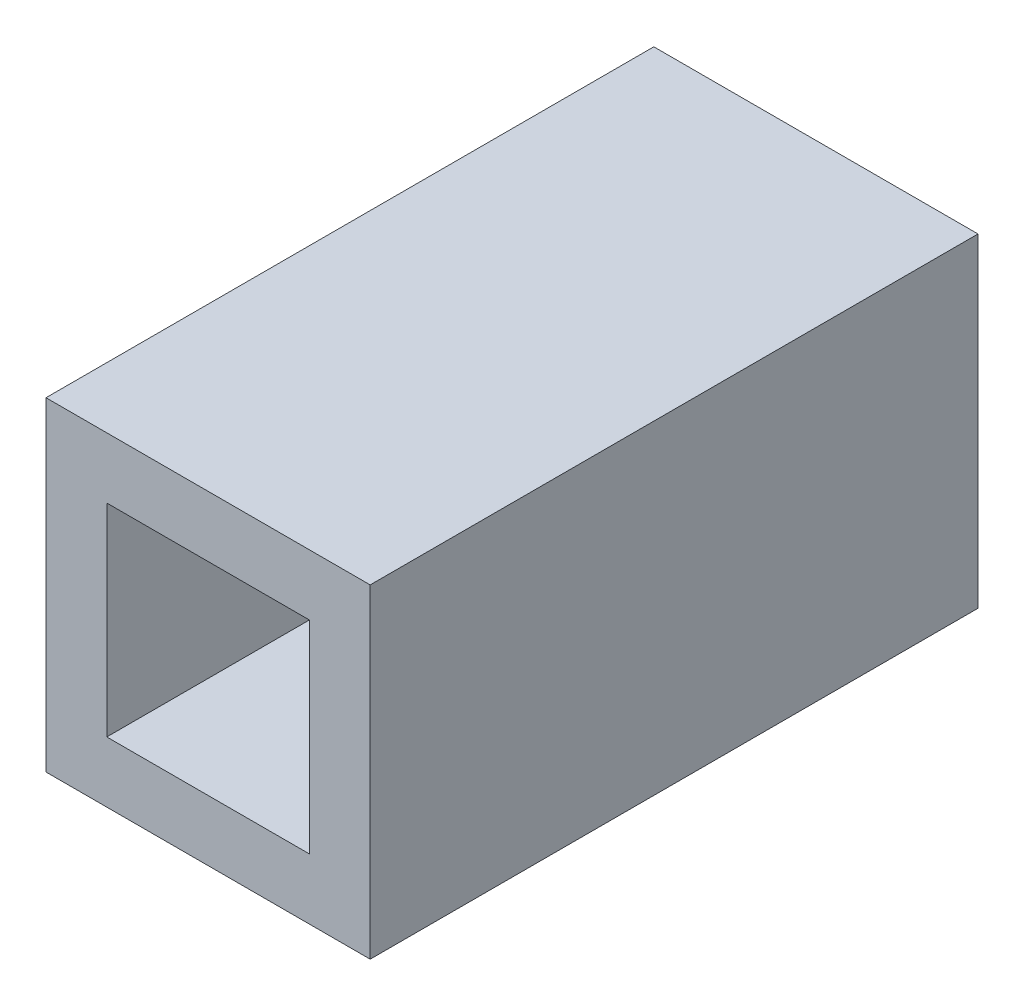
ISO-10303-21;
HEADER;
FILE_DESCRIPTION(('STEP AP214'),'2;1');
FILE_NAME('part.step','',(''),(''),'','','');
FILE_SCHEMA(('AUTOMOTIVE_DESIGN { 1 0 10303 214 1 1 1 1 }'));
ENDSEC;
DATA;
#1=APPLICATION_CONTEXT('core data for automotive mechanical design processes');
#2=APPLICATION_PROTOCOL_DEFINITION('international standard','automotive_design',2000,#1);
#3=PRODUCT_CONTEXT('',#1,'mechanical');
#4=PRODUCT('Part','Part','',(#3));
#5=PRODUCT_RELATED_PRODUCT_CATEGORY('part','',(#4));
#6=PRODUCT_DEFINITION_FORMATION('','',#4);
#7=PRODUCT_DEFINITION_CONTEXT('part definition',#1,'design');
#8=PRODUCT_DEFINITION('design','',#6,#7);
#9=PRODUCT_DEFINITION_SHAPE('','',#8);
#10=(LENGTH_UNIT() NAMED_UNIT(*) SI_UNIT(.MILLI.,.METRE.));
#11=(NAMED_UNIT(*) PLANE_ANGLE_UNIT() SI_UNIT($,.RADIAN.));
#12=(NAMED_UNIT(*) SI_UNIT($,.STERADIAN.) SOLID_ANGLE_UNIT());
#13=UNCERTAINTY_MEASURE_WITH_UNIT(LENGTH_MEASURE(1.E-05),#10,'distance_accuracy_value','');
#14=(GEOMETRIC_REPRESENTATION_CONTEXT(3) GLOBAL_UNCERTAINTY_ASSIGNED_CONTEXT((#13)) GLOBAL_UNIT_ASSIGNED_CONTEXT((#10,
#11,#12)) REPRESENTATION_CONTEXT('',''));
#15=CARTESIAN_POINT('',(0.,0.,0.));
#16=DIRECTION('',(0.,0.,1.));
#17=DIRECTION('',(1.,0.,0.));
#18=AXIS2_PLACEMENT_3D('',#15,#16,#17);
#19=CARTESIAN_POINT('',(0.,0.,150.));
#20=DIRECTION('',(0.,0.,-1.));
#21=DIRECTION('',(-1.,0.,0.));
#22=AXIS2_PLACEMENT_3D('',#19,#20,#21);
#23=PLANE('',#22);
#24=DIRECTION('',(0.,-1.,0.));
#25=VECTOR('',#24,1.);
#26=CARTESIAN_POINT('',(-40.,40.,150.));
#27=LINE('',#26,#25);
#28=CARTESIAN_POINT('',(-40.,40.,150.));
#29=VERTEX_POINT('',#28);
#30=CARTESIAN_POINT('',(-40.,-40.,150.));
#31=VERTEX_POINT('',#30);
#32=EDGE_CURVE('E137',#29,#31,#27,.T.);
#33=ORIENTED_EDGE('',*,*,#32,.T.);
#34=DIRECTION('',(1.,0.,0.));
#35=VECTOR('',#34,1.);
#36=CARTESIAN_POINT('',(40.,-40.,150.));
#37=LINE('',#36,#35);
#38=CARTESIAN_POINT('',(40.,-40.,150.));
#39=VERTEX_POINT('',#38);
#40=EDGE_CURVE('E140',#31,#39,#37,.T.);
#41=ORIENTED_EDGE('',*,*,#40,.T.);
#42=DIRECTION('',(0.,1.,0.));
#43=VECTOR('',#42,1.);
#44=CARTESIAN_POINT('',(40.,40.,150.));
#45=LINE('',#44,#43);
#46=CARTESIAN_POINT('',(40.,40.,150.));
#47=VERTEX_POINT('',#46);
#48=EDGE_CURVE('E143',#39,#47,#45,.T.);
#49=ORIENTED_EDGE('',*,*,#48,.T.);
#50=DIRECTION('',(-1.,0.,0.));
#51=VECTOR('',#50,1.);
#52=CARTESIAN_POINT('',(40.,40.,150.));
#53=LINE('',#52,#51);
#54=EDGE_CURVE('E145',#47,#29,#53,.T.);
#55=ORIENTED_EDGE('',*,*,#54,.T.);
#56=EDGE_LOOP('',(#33,#41,#49,#55));
#57=FACE_BOUND('',#56,.T.);
#58=DIRECTION('',(0.,1.,0.));
#59=VECTOR('',#58,1.);
#60=CARTESIAN_POINT('',(25.,25.,150.));
#61=LINE('',#60,#59);
#62=CARTESIAN_POINT('',(25.,-25.,150.));
#63=VERTEX_POINT('',#62);
#64=CARTESIAN_POINT('',(25.,25.,150.));
#65=VERTEX_POINT('',#64);
#66=EDGE_CURVE('E99',#63,#65,#61,.T.);
#67=ORIENTED_EDGE('',*,*,#66,.F.);
#68=DIRECTION('',(1.,0.,0.));
#69=VECTOR('',#68,1.);
#70=CARTESIAN_POINT('',(25.,-25.,150.));
#71=LINE('',#70,#69);
#72=CARTESIAN_POINT('',(-25.,-25.,150.));
#73=VERTEX_POINT('',#72);
#74=EDGE_CURVE('E121',#73,#63,#71,.T.);
#75=ORIENTED_EDGE('',*,*,#74,.F.);
#76=DIRECTION('',(0.,-1.,0.));
#77=VECTOR('',#76,1.);
#78=CARTESIAN_POINT('',(-25.,25.,150.));
#79=LINE('',#78,#77);
#80=CARTESIAN_POINT('',(-25.,25.,150.));
#81=VERTEX_POINT('',#80);
#82=EDGE_CURVE('E119',#81,#73,#79,.T.);
#83=ORIENTED_EDGE('',*,*,#82,.F.);
#84=DIRECTION('',(-1.,0.,0.));
#85=VECTOR('',#84,1.);
#86=CARTESIAN_POINT('',(25.,25.,150.));
#87=LINE('',#86,#85);
#88=EDGE_CURVE('E107',#65,#81,#87,.T.);
#89=ORIENTED_EDGE('',*,*,#88,.F.);
#90=EDGE_LOOP('',(#67,#75,#83,#89));
#91=FACE_BOUND('',#90,.T.);
#92=ADVANCED_FACE('F34',(#57,#91),#23,.F.);
#93=CARTESIAN_POINT('',(0.,0.,0.));
#94=DIRECTION('',(0.,0.,-1.));
#95=DIRECTION('',(-1.,0.,0.));
#96=AXIS2_PLACEMENT_3D('',#93,#94,#95);
#97=PLANE('',#96);
#98=DIRECTION('',(0.,-1.,0.));
#99=VECTOR('',#98,1.);
#100=CARTESIAN_POINT('',(-40.,40.,0.));
#101=LINE('',#100,#99);
#102=CARTESIAN_POINT('',(-40.,40.,0.));
#103=VERTEX_POINT('',#102);
#104=CARTESIAN_POINT('',(-40.,-40.,0.));
#105=VERTEX_POINT('',#104);
#106=EDGE_CURVE('E115',#103,#105,#101,.T.);
#107=ORIENTED_EDGE('',*,*,#106,.F.);
#108=DIRECTION('',(-1.,0.,0.));
#109=VECTOR('',#108,1.);
#110=CARTESIAN_POINT('',(40.,40.,0.));
#111=LINE('',#110,#109);
#112=CARTESIAN_POINT('',(40.,40.,0.));
#113=VERTEX_POINT('',#112);
#114=EDGE_CURVE('E141',#113,#103,#111,.T.);
#115=ORIENTED_EDGE('',*,*,#114,.F.);
#116=DIRECTION('',(0.,1.,0.));
#117=VECTOR('',#116,1.);
#118=CARTESIAN_POINT('',(40.,40.,0.));
#119=LINE('',#118,#117);
#120=CARTESIAN_POINT('',(40.,-40.,0.));
#121=VERTEX_POINT('',#120);
#122=EDGE_CURVE('E152',#121,#113,#119,.T.);
#123=ORIENTED_EDGE('',*,*,#122,.F.);
#124=DIRECTION('',(1.,0.,0.));
#125=VECTOR('',#124,1.);
#126=CARTESIAN_POINT('',(40.,-40.,0.));
#127=LINE('',#126,#125);
#128=EDGE_CURVE('E150',#105,#121,#127,.T.);
#129=ORIENTED_EDGE('',*,*,#128,.F.);
#130=EDGE_LOOP('',(#107,#115,#123,#129));
#131=FACE_BOUND('',#130,.T.);
#132=DIRECTION('',(1.,0.,0.));
#133=VECTOR('',#132,1.);
#134=CARTESIAN_POINT('',(25.,-25.,0.));
#135=LINE('',#134,#133);
#136=CARTESIAN_POINT('',(-25.,-25.,0.));
#137=VERTEX_POINT('',#136);
#138=CARTESIAN_POINT('',(25.,-25.,0.));
#139=VERTEX_POINT('',#138);
#140=EDGE_CURVE('E108',#137,#139,#135,.T.);
#141=ORIENTED_EDGE('',*,*,#140,.T.);
#142=DIRECTION('',(0.,1.,0.));
#143=VECTOR('',#142,1.);
#144=CARTESIAN_POINT('',(25.,25.,0.));
#145=LINE('',#144,#143);
#146=CARTESIAN_POINT('',(25.,25.,0.));
#147=VERTEX_POINT('',#146);
#148=EDGE_CURVE('E57',#139,#147,#145,.T.);
#149=ORIENTED_EDGE('',*,*,#148,.T.);
#150=DIRECTION('',(-1.,0.,0.));
#151=VECTOR('',#150,1.);
#152=CARTESIAN_POINT('',(25.,25.,0.));
#153=LINE('',#152,#151);
#154=CARTESIAN_POINT('',(-25.,25.,0.));
#155=VERTEX_POINT('',#154);
#156=EDGE_CURVE('E114',#147,#155,#153,.T.);
#157=ORIENTED_EDGE('',*,*,#156,.T.);
#158=DIRECTION('',(0.,-1.,0.));
#159=VECTOR('',#158,1.);
#160=CARTESIAN_POINT('',(-25.,25.,0.));
#161=LINE('',#160,#159);
#162=EDGE_CURVE('E129',#155,#137,#161,.T.);
#163=ORIENTED_EDGE('',*,*,#162,.T.);
#164=EDGE_LOOP('',(#141,#149,#157,#163));
#165=FACE_BOUND('',#164,.T.);
#166=ADVANCED_FACE('F170',(#131,#165),#97,.T.);
#167=CARTESIAN_POINT('',(-40.,40.,150.));
#168=DIRECTION('',(1.,0.,0.));
#169=DIRECTION('',(0.,1.,0.));
#170=AXIS2_PLACEMENT_3D('',#167,#168,#169);
#171=PLANE('',#170);
#172=CARTESIAN_POINT('',(-40.,0.,75.));
#173=DIRECTION('',(-1.,0.,0.));
#174=DIRECTION('',(0.,-1.,0.));
#175=AXIS2_PLACEMENT_3D('',#172,#173,#174);
#176=CIRCLE('',#175,5.);
#177=CARTESIAN_POINT('',(-40.,-5.00000000000001,75.));
#178=VERTEX_POINT('',#177);
#179=EDGE_CURVE('E225',#178,#178,#176,.T.);
#180=ORIENTED_EDGE('',*,*,#179,.F.);
#181=EDGE_LOOP('',(#180));
#182=FACE_BOUND('',#181,.T.);
#183=ORIENTED_EDGE('',*,*,#106,.T.);
#184=DIRECTION('',(0.,0.,-1.));
#185=VECTOR('',#184,1.);
#186=CARTESIAN_POINT('',(-40.,-40.,150.));
#187=LINE('',#186,#185);
#188=EDGE_CURVE('E11',#31,#105,#187,.T.);
#189=ORIENTED_EDGE('',*,*,#188,.F.);
#190=ORIENTED_EDGE('',*,*,#32,.F.);
#191=DIRECTION('',(0.,0.,-1.));
#192=VECTOR('',#191,1.);
#193=CARTESIAN_POINT('',(-40.,40.,150.));
#194=LINE('',#193,#192);
#195=EDGE_CURVE('E147',#29,#103,#194,.T.);
#196=ORIENTED_EDGE('',*,*,#195,.T.);
#197=EDGE_LOOP('',(#183,#189,#190,#196));
#198=FACE_BOUND('',#197,.T.);
#199=ADVANCED_FACE('F36',(#182,#198),#171,.F.);
#200=CARTESIAN_POINT('',(40.,-40.,150.));
#201=DIRECTION('',(0.,1.,0.));
#202=DIRECTION('',(-1.,0.,0.));
#203=AXIS2_PLACEMENT_3D('',#200,#201,#202);
#204=PLANE('',#203);
#205=ORIENTED_EDGE('',*,*,#128,.T.);
#206=DIRECTION('',(0.,0.,-1.));
#207=VECTOR('',#206,1.);
#208=CARTESIAN_POINT('',(40.,-40.,150.));
#209=LINE('',#208,#207);
#210=EDGE_CURVE('E42',#39,#121,#209,.T.);
#211=ORIENTED_EDGE('',*,*,#210,.F.);
#212=ORIENTED_EDGE('',*,*,#40,.F.);
#213=ORIENTED_EDGE('',*,*,#188,.T.);
#214=EDGE_LOOP('',(#205,#211,#212,#213));
#215=FACE_BOUND('',#214,.T.);
#216=ADVANCED_FACE('F180',(#215),#204,.F.);
#217=CARTESIAN_POINT('',(40.,40.,150.));
#218=DIRECTION('',(-1.,0.,0.));
#219=DIRECTION('',(0.,-1.,0.));
#220=AXIS2_PLACEMENT_3D('',#217,#218,#219);
#221=PLANE('',#220);
#222=ORIENTED_EDGE('',*,*,#122,.T.);
#223=DIRECTION('',(0.,0.,-1.));
#224=VECTOR('',#223,1.);
#225=CARTESIAN_POINT('',(40.,40.,150.));
#226=LINE('',#225,#224);
#227=EDGE_CURVE('E157',#47,#113,#226,.T.);
#228=ORIENTED_EDGE('',*,*,#227,.F.);
#229=ORIENTED_EDGE('',*,*,#48,.F.);
#230=ORIENTED_EDGE('',*,*,#210,.T.);
#231=EDGE_LOOP('',(#222,#228,#229,#230));
#232=FACE_BOUND('',#231,.T.);
#233=ADVANCED_FACE('F164',(#232),#221,.F.);
#234=CARTESIAN_POINT('',(40.,40.,150.));
#235=DIRECTION('',(0.,-1.,0.));
#236=DIRECTION('',(1.,0.,0.));
#237=AXIS2_PLACEMENT_3D('',#234,#235,#236);
#238=PLANE('',#237);
#239=ORIENTED_EDGE('',*,*,#114,.T.);
#240=ORIENTED_EDGE('',*,*,#195,.F.);
#241=ORIENTED_EDGE('',*,*,#54,.F.);
#242=ORIENTED_EDGE('',*,*,#227,.T.);
#243=EDGE_LOOP('',(#239,#240,#241,#242));
#244=FACE_BOUND('',#243,.T.);
#245=ADVANCED_FACE('F174',(#244),#238,.F.);
#246=CARTESIAN_POINT('',(25.,25.,150.));
#247=DIRECTION('',(-1.,0.,0.));
#248=DIRECTION('',(0.,-1.,0.));
#249=AXIS2_PLACEMENT_3D('',#246,#247,#248);
#250=PLANE('',#249);
#251=ORIENTED_EDGE('',*,*,#148,.F.);
#252=DIRECTION('',(0.,0.,-1.));
#253=VECTOR('',#252,1.);
#254=CARTESIAN_POINT('',(25.,-25.,150.));
#255=LINE('',#254,#253);
#256=EDGE_CURVE('E103',#63,#139,#255,.T.);
#257=ORIENTED_EDGE('',*,*,#256,.F.);
#258=ORIENTED_EDGE('',*,*,#66,.T.);
#259=DIRECTION('',(0.,0.,-1.));
#260=VECTOR('',#259,1.);
#261=CARTESIAN_POINT('',(25.,25.,150.));
#262=LINE('',#261,#260);
#263=EDGE_CURVE('E102',#65,#147,#262,.T.);
#264=ORIENTED_EDGE('',*,*,#263,.T.);
#265=EDGE_LOOP('',(#251,#257,#258,#264));
#266=FACE_BOUND('',#265,.T.);
#267=ADVANCED_FACE('F101',(#266),#250,.T.);
#268=CARTESIAN_POINT('',(25.,25.,150.));
#269=DIRECTION('',(0.,-1.,0.));
#270=DIRECTION('',(1.,0.,0.));
#271=AXIS2_PLACEMENT_3D('',#268,#269,#270);
#272=PLANE('',#271);
#273=ORIENTED_EDGE('',*,*,#156,.F.);
#274=ORIENTED_EDGE('',*,*,#263,.F.);
#275=ORIENTED_EDGE('',*,*,#88,.T.);
#276=DIRECTION('',(0.,0.,-1.));
#277=VECTOR('',#276,1.);
#278=CARTESIAN_POINT('',(-25.,25.,150.));
#279=LINE('',#278,#277);
#280=EDGE_CURVE('E116',#81,#155,#279,.T.);
#281=ORIENTED_EDGE('',*,*,#280,.T.);
#282=EDGE_LOOP('',(#273,#274,#275,#281));
#283=FACE_BOUND('',#282,.T.);
#284=ADVANCED_FACE('F111',(#283),#272,.T.);
#285=CARTESIAN_POINT('',(-25.,25.,150.));
#286=DIRECTION('',(1.,0.,0.));
#287=DIRECTION('',(0.,1.,0.));
#288=AXIS2_PLACEMENT_3D('',#285,#286,#287);
#289=PLANE('',#288);
#290=ORIENTED_EDGE('',*,*,#162,.F.);
#291=ORIENTED_EDGE('',*,*,#280,.F.);
#292=ORIENTED_EDGE('',*,*,#82,.T.);
#293=DIRECTION('',(0.,0.,-1.));
#294=VECTOR('',#293,1.);
#295=CARTESIAN_POINT('',(-25.,-25.,150.));
#296=LINE('',#295,#294);
#297=EDGE_CURVE('E49',#73,#137,#296,.T.);
#298=ORIENTED_EDGE('',*,*,#297,.T.);
#299=EDGE_LOOP('',(#290,#291,#292,#298));
#300=FACE_BOUND('',#299,.T.);
#301=ADVANCED_FACE('F204',(#300),#289,.T.);
#302=CARTESIAN_POINT('',(25.,-25.,150.));
#303=DIRECTION('',(0.,1.,0.));
#304=DIRECTION('',(-1.,0.,0.));
#305=AXIS2_PLACEMENT_3D('',#302,#303,#304);
#306=PLANE('',#305);
#307=ORIENTED_EDGE('',*,*,#140,.F.);
#308=ORIENTED_EDGE('',*,*,#297,.F.);
#309=ORIENTED_EDGE('',*,*,#74,.T.);
#310=ORIENTED_EDGE('',*,*,#256,.T.);
#311=EDGE_LOOP('',(#307,#308,#309,#310));
#312=FACE_BOUND('',#311,.T.);
#313=ADVANCED_FACE('F208',(#312),#306,.T.);
#314=CARTESIAN_POINT('',(-35.,0.,75.));
#315=DIRECTION('',(-1.,0.,0.));
#316=DIRECTION('',(0.,-1.,0.));
#317=AXIS2_PLACEMENT_3D('',#314,#315,#316);
#318=CYLINDRICAL_SURFACE('',#317,5.);
#319=CARTESIAN_POINT('',(-35.,0.,75.));
#320=DIRECTION('',(-1.,0.,0.));
#321=DIRECTION('',(0.,-1.,0.));
#322=AXIS2_PLACEMENT_3D('',#319,#320,#321);
#323=CIRCLE('',#322,5.);
#324=CARTESIAN_POINT('',(-35.,-5.00000000000001,75.));
#325=VERTEX_POINT('',#324);
#326=EDGE_CURVE('E127',#325,#325,#323,.T.);
#327=ORIENTED_EDGE('',*,*,#326,.F.);
#328=EDGE_LOOP('',(#327));
#329=FACE_BOUND('',#328,.T.);
#330=ORIENTED_EDGE('',*,*,#179,.T.);
#331=EDGE_LOOP('',(#330));
#332=FACE_BOUND('',#331,.T.);
#333=ADVANCED_FACE('F214',(#329,#332),#318,.F.);
#334=CARTESIAN_POINT('',(-35.,0.,75.));
#335=DIRECTION('',(-1.,0.,0.));
#336=DIRECTION('',(0.,-1.,0.));
#337=AXIS2_PLACEMENT_3D('',#334,#335,#336);
#338=PLANE('',#337);
#339=ORIENTED_EDGE('',*,*,#326,.T.);
#340=EDGE_LOOP('',(#339));
#341=FACE_BOUND('',#340,.T.);
#342=ADVANCED_FACE('F217',(#341),#338,.T.);
#343=CLOSED_SHELL('',(#92,#166,#199,#216,#233,#245,#267,#284,#301,#313,#333,#342));
#344=MANIFOLD_SOLID_BREP('B2',#343);
#345=ADVANCED_BREP_SHAPE_REPRESENTATION('',(#18,#344),#14);
#346=SHAPE_DEFINITION_REPRESENTATION(#9,#345);
ENDSEC;
END-ISO-10303-21;
